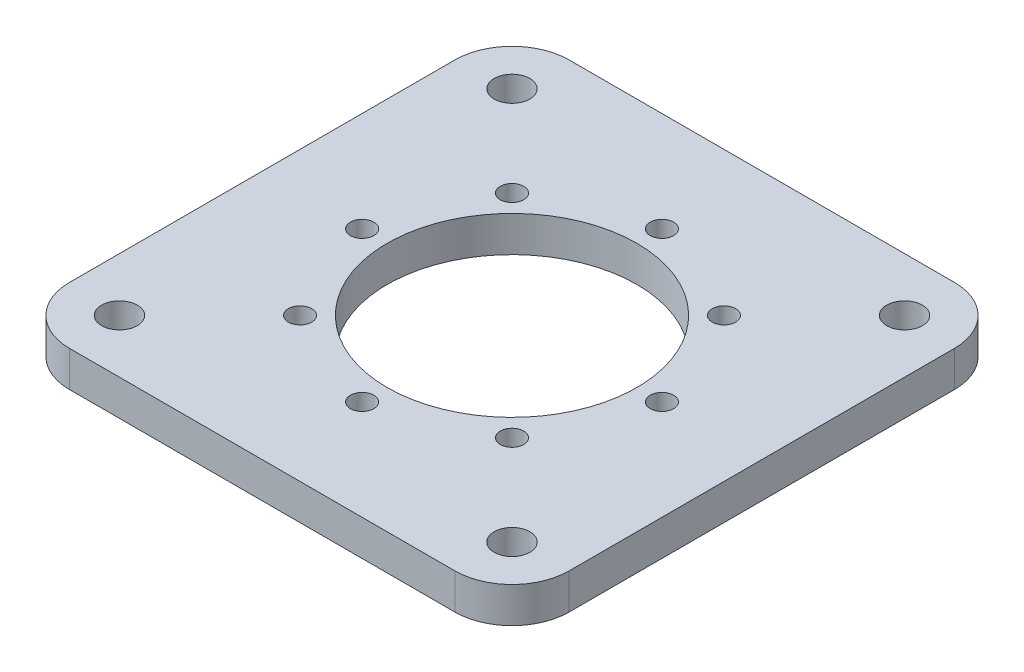
ISO-10303-21;
HEADER;
FILE_DESCRIPTION(('STEP AP214'),'2;1');
FILE_NAME('part.step','',(''),(''),'','','');
FILE_SCHEMA(('AUTOMOTIVE_DESIGN { 1 0 10303 214 1 1 1 1 }'));
ENDSEC;
DATA;
#1=APPLICATION_CONTEXT('core data for automotive mechanical design processes');
#2=APPLICATION_PROTOCOL_DEFINITION('international standard','automotive_design',2000,#1);
#3=PRODUCT_CONTEXT('',#1,'mechanical');
#4=PRODUCT('Part','Part','',(#3));
#5=PRODUCT_RELATED_PRODUCT_CATEGORY('part','',(#4));
#6=PRODUCT_DEFINITION_FORMATION('','',#4);
#7=PRODUCT_DEFINITION_CONTEXT('part definition',#1,'design');
#8=PRODUCT_DEFINITION('design','',#6,#7);
#9=PRODUCT_DEFINITION_SHAPE('','',#8);
#10=(LENGTH_UNIT() NAMED_UNIT(*) SI_UNIT(.MILLI.,.METRE.));
#11=(NAMED_UNIT(*) PLANE_ANGLE_UNIT() SI_UNIT($,.RADIAN.));
#12=(NAMED_UNIT(*) SI_UNIT($,.STERADIAN.) SOLID_ANGLE_UNIT());
#13=UNCERTAINTY_MEASURE_WITH_UNIT(LENGTH_MEASURE(1.E-05),#10,'distance_accuracy_value','');
#14=(GEOMETRIC_REPRESENTATION_CONTEXT(3) GLOBAL_UNCERTAINTY_ASSIGNED_CONTEXT((#13)) GLOBAL_UNIT_ASSIGNED_CONTEXT((#10,
#11,#12)) REPRESENTATION_CONTEXT('',''));
#15=CARTESIAN_POINT('',(0.,0.,0.));
#16=DIRECTION('',(0.,0.,1.));
#17=DIRECTION('',(1.,0.,0.));
#18=AXIS2_PLACEMENT_3D('',#15,#16,#17);
#19=CARTESIAN_POINT('',(34.29,6.35,-34.29));
#20=DIRECTION('',(0.,-1.,0.));
#21=DIRECTION('',(0.,0.,-1.));
#22=AXIS2_PLACEMENT_3D('',#19,#20,#21);
#23=PLANE('',#22);
#24=CARTESIAN_POINT('',(26.67,6.35,0.));
#25=DIRECTION('',(0.,1.,0.));
#26=DIRECTION('',(0.,0.,1.));
#27=AXIS2_PLACEMENT_3D('',#24,#25,#26);
#28=CIRCLE('',#27,2.0828);
#29=CARTESIAN_POINT('',(26.67,6.35,2.0828));
#30=VERTEX_POINT('',#29);
#31=EDGE_CURVE('E258',#30,#30,#28,.T.);
#32=ORIENTED_EDGE('',*,*,#31,.F.);
#33=EDGE_LOOP('',(#32));
#34=FACE_BOUND('',#33,.T.);
#35=CARTESIAN_POINT('',(18.8585378542452,6.35,18.8585378542452));
#36=DIRECTION('',(0.,1.,0.));
#37=DIRECTION('',(0.,0.,1.));
#38=AXIS2_PLACEMENT_3D('',#35,#36,#37);
#39=CIRCLE('',#38,2.0828);
#40=CARTESIAN_POINT('',(18.8585378542452,6.35,20.9413378542452));
#41=VERTEX_POINT('',#40);
#42=EDGE_CURVE('E255',#41,#41,#39,.T.);
#43=ORIENTED_EDGE('',*,*,#42,.F.);
#44=EDGE_LOOP('',(#43));
#45=FACE_BOUND('',#44,.T.);
#46=CARTESIAN_POINT('',(0.,6.35,26.67));
#47=DIRECTION('',(0.,1.,0.));
#48=DIRECTION('',(0.,0.,1.));
#49=AXIS2_PLACEMENT_3D('',#46,#47,#48);
#50=CIRCLE('',#49,2.0828);
#51=CARTESIAN_POINT('',(0.,6.35,28.7528));
#52=VERTEX_POINT('',#51);
#53=EDGE_CURVE('E249',#52,#52,#50,.T.);
#54=ORIENTED_EDGE('',*,*,#53,.F.);
#55=EDGE_LOOP('',(#54));
#56=FACE_BOUND('',#55,.T.);
#57=CARTESIAN_POINT('',(-18.8585378542452,6.35,18.8585378542452));
#58=DIRECTION('',(0.,1.,0.));
#59=DIRECTION('',(0.,0.,1.));
#60=AXIS2_PLACEMENT_3D('',#57,#58,#59);
#61=CIRCLE('',#60,2.0828);
#62=CARTESIAN_POINT('',(-18.8585378542452,6.35,20.9413378542452));
#63=VERTEX_POINT('',#62);
#64=EDGE_CURVE('E243',#63,#63,#61,.T.);
#65=ORIENTED_EDGE('',*,*,#64,.F.);
#66=EDGE_LOOP('',(#65));
#67=FACE_BOUND('',#66,.T.);
#68=CARTESIAN_POINT('',(-26.67,6.35,0.));
#69=DIRECTION('',(0.,1.,0.));
#70=DIRECTION('',(0.,0.,1.));
#71=AXIS2_PLACEMENT_3D('',#68,#69,#70);
#72=CIRCLE('',#71,2.08279999999999);
#73=CARTESIAN_POINT('',(-26.67,6.35,2.0828));
#74=VERTEX_POINT('',#73);
#75=EDGE_CURVE('E237',#74,#74,#72,.T.);
#76=ORIENTED_EDGE('',*,*,#75,.F.);
#77=EDGE_LOOP('',(#76));
#78=FACE_BOUND('',#77,.T.);
#79=CARTESIAN_POINT('',(-18.8585378542452,6.35,-18.8585378542452));
#80=DIRECTION('',(0.,1.,0.));
#81=DIRECTION('',(0.,0.,1.));
#82=AXIS2_PLACEMENT_3D('',#79,#80,#81);
#83=CIRCLE('',#82,2.0828);
#84=CARTESIAN_POINT('',(-18.8585378542452,6.35,-16.7757378542452));
#85=VERTEX_POINT('',#84);
#86=EDGE_CURVE('E231',#85,#85,#83,.T.);
#87=ORIENTED_EDGE('',*,*,#86,.F.);
#88=EDGE_LOOP('',(#87));
#89=FACE_BOUND('',#88,.T.);
#90=CARTESIAN_POINT('',(0.,6.35,-26.67));
#91=DIRECTION('',(0.,1.,0.));
#92=DIRECTION('',(0.,0.,1.));
#93=AXIS2_PLACEMENT_3D('',#90,#91,#92);
#94=CIRCLE('',#93,2.0828);
#95=CARTESIAN_POINT('',(0.,6.35,-24.5872));
#96=VERTEX_POINT('',#95);
#97=EDGE_CURVE('E225',#96,#96,#94,.T.);
#98=ORIENTED_EDGE('',*,*,#97,.F.);
#99=EDGE_LOOP('',(#98));
#100=FACE_BOUND('',#99,.T.);
#101=CARTESIAN_POINT('',(18.8585378542452,6.35,-18.8585378542452));
#102=DIRECTION('',(0.,1.,0.));
#103=DIRECTION('',(0.,0.,1.));
#104=AXIS2_PLACEMENT_3D('',#101,#102,#103);
#105=CIRCLE('',#104,2.0828);
#106=CARTESIAN_POINT('',(18.8585378542452,6.35,-16.7757378542452));
#107=VERTEX_POINT('',#106);
#108=EDGE_CURVE('E218',#107,#107,#105,.T.);
#109=ORIENTED_EDGE('',*,*,#108,.F.);
#110=EDGE_LOOP('',(#109));
#111=FACE_BOUND('',#110,.T.);
#112=CARTESIAN_POINT('',(34.29,6.35,-34.29));
#113=DIRECTION('',(0.,1.,0.));
#114=DIRECTION('',(0.,0.,-1.));
#115=AXIS2_PLACEMENT_3D('',#112,#113,#114);
#116=CIRCLE('',#115,10.16);
#117=CARTESIAN_POINT('',(44.45,6.35,-34.29));
#118=VERTEX_POINT('',#117);
#119=CARTESIAN_POINT('',(34.29,6.35,-44.45));
#120=VERTEX_POINT('',#119);
#121=EDGE_CURVE('E154',#118,#120,#116,.T.);
#122=ORIENTED_EDGE('',*,*,#121,.T.);
#123=DIRECTION('',(-1.,0.,0.));
#124=VECTOR('',#123,1.);
#125=CARTESIAN_POINT('',(-34.29,6.35,-44.45));
#126=LINE('',#125,#124);
#127=CARTESIAN_POINT('',(-34.29,6.35,-44.45));
#128=VERTEX_POINT('',#127);
#129=EDGE_CURVE('E102',#120,#128,#126,.T.);
#130=ORIENTED_EDGE('',*,*,#129,.T.);
#131=CARTESIAN_POINT('',(-34.29,6.35,-34.29));
#132=DIRECTION('',(0.,1.,0.));
#133=DIRECTION('',(0.,0.,-1.));
#134=AXIS2_PLACEMENT_3D('',#131,#132,#133);
#135=CIRCLE('',#134,10.16);
#136=CARTESIAN_POINT('',(-44.45,6.35,-34.29));
#137=VERTEX_POINT('',#136);
#138=EDGE_CURVE('E169',#128,#137,#135,.T.);
#139=ORIENTED_EDGE('',*,*,#138,.T.);
#140=DIRECTION('',(0.,0.,1.));
#141=VECTOR('',#140,1.);
#142=CARTESIAN_POINT('',(-44.45,6.35,34.29));
#143=LINE('',#142,#141);
#144=CARTESIAN_POINT('',(-44.45,6.35,34.29));
#145=VERTEX_POINT('',#144);
#146=EDGE_CURVE('E182',#137,#145,#143,.T.);
#147=ORIENTED_EDGE('',*,*,#146,.T.);
#148=CARTESIAN_POINT('',(-34.29,6.35,34.29));
#149=DIRECTION('',(0.,1.,0.));
#150=DIRECTION('',(0.,0.,-1.));
#151=AXIS2_PLACEMENT_3D('',#148,#149,#150);
#152=CIRCLE('',#151,10.16);
#153=CARTESIAN_POINT('',(-34.29,6.35,44.45));
#154=VERTEX_POINT('',#153);
#155=EDGE_CURVE('E121',#145,#154,#152,.T.);
#156=ORIENTED_EDGE('',*,*,#155,.T.);
#157=DIRECTION('',(1.,0.,0.));
#158=VECTOR('',#157,1.);
#159=CARTESIAN_POINT('',(-34.29,6.35,44.45));
#160=LINE('',#159,#158);
#161=CARTESIAN_POINT('',(34.29,6.35,44.45));
#162=VERTEX_POINT('',#161);
#163=EDGE_CURVE('E115',#154,#162,#160,.T.);
#164=ORIENTED_EDGE('',*,*,#163,.T.);
#165=CARTESIAN_POINT('',(34.29,6.35,34.29));
#166=DIRECTION('',(0.,1.,0.));
#167=DIRECTION('',(0.,0.,-1.));
#168=AXIS2_PLACEMENT_3D('',#165,#166,#167);
#169=CIRCLE('',#168,10.16);
#170=CARTESIAN_POINT('',(44.45,6.35,34.29));
#171=VERTEX_POINT('',#170);
#172=EDGE_CURVE('E119',#162,#171,#169,.T.);
#173=ORIENTED_EDGE('',*,*,#172,.T.);
#174=DIRECTION('',(0.,0.,-1.));
#175=VECTOR('',#174,1.);
#176=CARTESIAN_POINT('',(44.45,6.35,34.29));
#177=LINE('',#176,#175);
#178=EDGE_CURVE('E59',#171,#118,#177,.T.);
#179=ORIENTED_EDGE('',*,*,#178,.T.);
#180=EDGE_LOOP('',(#122,#130,#139,#147,#156,#164,#173,#179));
#181=FACE_BOUND('',#180,.T.);
#182=CARTESIAN_POINT('',(0.,6.35,0.));
#183=DIRECTION('',(0.,1.,0.));
#184=DIRECTION('',(0.,0.,1.));
#185=AXIS2_PLACEMENT_3D('',#182,#183,#184);
#186=CIRCLE('',#185,22.225);
#187=CARTESIAN_POINT('',(0.,6.35,22.225));
#188=VERTEX_POINT('',#187);
#189=EDGE_CURVE('E143',#188,#188,#186,.T.);
#190=ORIENTED_EDGE('',*,*,#189,.F.);
#191=EDGE_LOOP('',(#190));
#192=FACE_BOUND('',#191,.T.);
#193=CARTESIAN_POINT('',(-34.925,6.35,-34.925));
#194=DIRECTION('',(0.,1.,0.));
#195=DIRECTION('',(0.,0.,1.));
#196=AXIS2_PLACEMENT_3D('',#193,#194,#195);
#197=CIRCLE('',#196,3.175);
#198=CARTESIAN_POINT('',(-34.925,6.35,-31.75));
#199=VERTEX_POINT('',#198);
#200=EDGE_CURVE('E191',#199,#199,#197,.T.);
#201=ORIENTED_EDGE('',*,*,#200,.F.);
#202=EDGE_LOOP('',(#201));
#203=FACE_BOUND('',#202,.T.);
#204=CARTESIAN_POINT('',(34.925,6.35,-34.925));
#205=DIRECTION('',(0.,1.,0.));
#206=DIRECTION('',(0.,0.,-1.));
#207=AXIS2_PLACEMENT_3D('',#204,#205,#206);
#208=CIRCLE('',#207,3.175);
#209=CARTESIAN_POINT('',(34.925,6.35,-38.1));
#210=VERTEX_POINT('',#209);
#211=EDGE_CURVE('E197',#210,#210,#208,.T.);
#212=ORIENTED_EDGE('',*,*,#211,.F.);
#213=EDGE_LOOP('',(#212));
#214=FACE_BOUND('',#213,.T.);
#215=CARTESIAN_POINT('',(34.925,6.35,34.925));
#216=DIRECTION('',(0.,1.,0.));
#217=DIRECTION('',(0.,0.,1.));
#218=AXIS2_PLACEMENT_3D('',#215,#216,#217);
#219=CIRCLE('',#218,3.175);
#220=CARTESIAN_POINT('',(34.925,6.35,38.1));
#221=VERTEX_POINT('',#220);
#222=EDGE_CURVE('E203',#221,#221,#219,.T.);
#223=ORIENTED_EDGE('',*,*,#222,.F.);
#224=EDGE_LOOP('',(#223));
#225=FACE_BOUND('',#224,.T.);
#226=CARTESIAN_POINT('',(-34.925,6.35,34.925));
#227=DIRECTION('',(0.,1.,0.));
#228=DIRECTION('',(0.,0.,-1.));
#229=AXIS2_PLACEMENT_3D('',#226,#227,#228);
#230=CIRCLE('',#229,3.175);
#231=CARTESIAN_POINT('',(-34.925,6.35,31.75));
#232=VERTEX_POINT('',#231);
#233=EDGE_CURVE('E209',#232,#232,#230,.T.);
#234=ORIENTED_EDGE('',*,*,#233,.F.);
#235=EDGE_LOOP('',(#234));
#236=FACE_BOUND('',#235,.T.);
#237=ADVANCED_FACE('F42',(#34,#45,#56,#67,#78,#89,#100,#111,#181,#192,#203,#214,#225,#236),#23,.F.);
#238=CARTESIAN_POINT('',(34.29,0.,-34.29));
#239=DIRECTION('',(0.,-1.,0.));
#240=DIRECTION('',(0.,0.,-1.));
#241=AXIS2_PLACEMENT_3D('',#238,#239,#240);
#242=PLANE('',#241);
#243=CARTESIAN_POINT('',(26.67,0.,0.));
#244=DIRECTION('',(0.,-1.,0.));
#245=DIRECTION('',(0.,0.,-1.));
#246=AXIS2_PLACEMENT_3D('',#243,#244,#245);
#247=CIRCLE('',#246,2.0828);
#248=CARTESIAN_POINT('',(26.67,0.,-2.0828));
#249=VERTEX_POINT('',#248);
#250=EDGE_CURVE('E215',#249,#249,#247,.F.);
#251=ORIENTED_EDGE('',*,*,#250,.T.);
#252=EDGE_LOOP('',(#251));
#253=FACE_BOUND('',#252,.T.);
#254=CARTESIAN_POINT('',(18.8585378542452,0.,18.8585378542452));
#255=DIRECTION('',(0.,-1.,0.));
#256=DIRECTION('',(0.,0.,-1.));
#257=AXIS2_PLACEMENT_3D('',#254,#255,#256);
#258=CIRCLE('',#257,2.0828);
#259=CARTESIAN_POINT('',(18.8585378542452,0.,16.7757378542452));
#260=VERTEX_POINT('',#259);
#261=EDGE_CURVE('E252',#260,#260,#258,.F.);
#262=ORIENTED_EDGE('',*,*,#261,.T.);
#263=EDGE_LOOP('',(#262));
#264=FACE_BOUND('',#263,.T.);
#265=CARTESIAN_POINT('',(0.,0.,26.67));
#266=DIRECTION('',(0.,-1.,0.));
#267=DIRECTION('',(0.,0.,-1.));
#268=AXIS2_PLACEMENT_3D('',#265,#266,#267);
#269=CIRCLE('',#268,2.0828);
#270=CARTESIAN_POINT('',(0.,0.,24.5872));
#271=VERTEX_POINT('',#270);
#272=EDGE_CURVE('E246',#271,#271,#269,.F.);
#273=ORIENTED_EDGE('',*,*,#272,.T.);
#274=EDGE_LOOP('',(#273));
#275=FACE_BOUND('',#274,.T.);
#276=CARTESIAN_POINT('',(-18.8585378542452,0.,18.8585378542452));
#277=DIRECTION('',(0.,-1.,0.));
#278=DIRECTION('',(0.,0.,-1.));
#279=AXIS2_PLACEMENT_3D('',#276,#277,#278);
#280=CIRCLE('',#279,2.0828);
#281=CARTESIAN_POINT('',(-18.8585378542452,0.,16.7757378542452));
#282=VERTEX_POINT('',#281);
#283=EDGE_CURVE('E240',#282,#282,#280,.F.);
#284=ORIENTED_EDGE('',*,*,#283,.T.);
#285=EDGE_LOOP('',(#284));
#286=FACE_BOUND('',#285,.T.);
#287=CARTESIAN_POINT('',(-26.67,0.,0.));
#288=DIRECTION('',(0.,-1.,0.));
#289=DIRECTION('',(0.,0.,-1.));
#290=AXIS2_PLACEMENT_3D('',#287,#288,#289);
#291=CIRCLE('',#290,2.08279999999999);
#292=CARTESIAN_POINT('',(-26.67,0.,-2.08279999999999));
#293=VERTEX_POINT('',#292);
#294=EDGE_CURVE('E234',#293,#293,#291,.F.);
#295=ORIENTED_EDGE('',*,*,#294,.T.);
#296=EDGE_LOOP('',(#295));
#297=FACE_BOUND('',#296,.T.);
#298=CARTESIAN_POINT('',(-18.8585378542452,0.,-18.8585378542452));
#299=DIRECTION('',(0.,-1.,0.));
#300=DIRECTION('',(0.,0.,-1.));
#301=AXIS2_PLACEMENT_3D('',#298,#299,#300);
#302=CIRCLE('',#301,2.0828);
#303=CARTESIAN_POINT('',(-18.8585378542452,0.,-20.9413378542452));
#304=VERTEX_POINT('',#303);
#305=EDGE_CURVE('E228',#304,#304,#302,.F.);
#306=ORIENTED_EDGE('',*,*,#305,.T.);
#307=EDGE_LOOP('',(#306));
#308=FACE_BOUND('',#307,.T.);
#309=CARTESIAN_POINT('',(0.,0.,-26.67));
#310=DIRECTION('',(0.,-1.,0.));
#311=DIRECTION('',(0.,0.,-1.));
#312=AXIS2_PLACEMENT_3D('',#309,#310,#311);
#313=CIRCLE('',#312,2.0828);
#314=CARTESIAN_POINT('',(0.,0.,-28.7528));
#315=VERTEX_POINT('',#314);
#316=EDGE_CURVE('E221',#315,#315,#313,.F.);
#317=ORIENTED_EDGE('',*,*,#316,.T.);
#318=EDGE_LOOP('',(#317));
#319=FACE_BOUND('',#318,.T.);
#320=CARTESIAN_POINT('',(18.8585378542452,0.,-18.8585378542452));
#321=DIRECTION('',(0.,-1.,0.));
#322=DIRECTION('',(0.,0.,-1.));
#323=AXIS2_PLACEMENT_3D('',#320,#321,#322);
#324=CIRCLE('',#323,2.0828);
#325=CARTESIAN_POINT('',(18.8585378542452,0.,-20.9413378542452));
#326=VERTEX_POINT('',#325);
#327=EDGE_CURVE('E222',#326,#326,#324,.F.);
#328=ORIENTED_EDGE('',*,*,#327,.T.);
#329=EDGE_LOOP('',(#328));
#330=FACE_BOUND('',#329,.T.);
#331=CARTESIAN_POINT('',(34.925,0.,34.925));
#332=DIRECTION('',(0.,1.,0.));
#333=DIRECTION('',(0.,0.,1.));
#334=AXIS2_PLACEMENT_3D('',#331,#332,#333);
#335=CIRCLE('',#334,3.175);
#336=CARTESIAN_POINT('',(34.925,0.,38.1));
#337=VERTEX_POINT('',#336);
#338=EDGE_CURVE('E206',#337,#337,#335,.T.);
#339=ORIENTED_EDGE('',*,*,#338,.T.);
#340=EDGE_LOOP('',(#339));
#341=FACE_BOUND('',#340,.T.);
#342=CARTESIAN_POINT('',(-34.925,0.,-34.925));
#343=DIRECTION('',(0.,1.,0.));
#344=DIRECTION('',(0.,0.,1.));
#345=AXIS2_PLACEMENT_3D('',#342,#343,#344);
#346=CIRCLE('',#345,3.175);
#347=CARTESIAN_POINT('',(-34.925,0.,-31.75));
#348=VERTEX_POINT('',#347);
#349=EDGE_CURVE('E194',#348,#348,#346,.T.);
#350=ORIENTED_EDGE('',*,*,#349,.T.);
#351=EDGE_LOOP('',(#350));
#352=FACE_BOUND('',#351,.T.);
#353=CARTESIAN_POINT('',(34.29,0.,-34.29));
#354=DIRECTION('',(0.,1.,0.));
#355=DIRECTION('',(0.,0.,-1.));
#356=AXIS2_PLACEMENT_3D('',#353,#354,#355);
#357=CIRCLE('',#356,10.16);
#358=CARTESIAN_POINT('',(44.45,0.,-34.29));
#359=VERTEX_POINT('',#358);
#360=CARTESIAN_POINT('',(34.29,0.,-44.45));
#361=VERTEX_POINT('',#360);
#362=EDGE_CURVE('E139',#359,#361,#357,.T.);
#363=ORIENTED_EDGE('',*,*,#362,.F.);
#364=DIRECTION('',(0.,0.,-1.));
#365=VECTOR('',#364,1.);
#366=CARTESIAN_POINT('',(44.45,0.,34.29));
#367=LINE('',#366,#365);
#368=CARTESIAN_POINT('',(44.45,0.,34.29));
#369=VERTEX_POINT('',#368);
#370=EDGE_CURVE('E94',#369,#359,#367,.T.);
#371=ORIENTED_EDGE('',*,*,#370,.F.);
#372=CARTESIAN_POINT('',(34.29,0.,34.29));
#373=DIRECTION('',(0.,1.,0.));
#374=DIRECTION('',(0.,0.,-1.));
#375=AXIS2_PLACEMENT_3D('',#372,#373,#374);
#376=CIRCLE('',#375,10.16);
#377=CARTESIAN_POINT('',(34.29,0.,44.45));
#378=VERTEX_POINT('',#377);
#379=EDGE_CURVE('E88',#378,#369,#376,.T.);
#380=ORIENTED_EDGE('',*,*,#379,.F.);
#381=DIRECTION('',(1.,0.,0.));
#382=VECTOR('',#381,1.);
#383=CARTESIAN_POINT('',(-34.29,0.,44.45));
#384=LINE('',#383,#382);
#385=CARTESIAN_POINT('',(-34.29,0.,44.45));
#386=VERTEX_POINT('',#385);
#387=EDGE_CURVE('E129',#386,#378,#384,.T.);
#388=ORIENTED_EDGE('',*,*,#387,.F.);
#389=CARTESIAN_POINT('',(-34.29,0.,34.29));
#390=DIRECTION('',(0.,1.,0.));
#391=DIRECTION('',(0.,0.,-1.));
#392=AXIS2_PLACEMENT_3D('',#389,#390,#391);
#393=CIRCLE('',#392,10.16);
#394=CARTESIAN_POINT('',(-44.45,0.,34.29));
#395=VERTEX_POINT('',#394);
#396=EDGE_CURVE('E149',#395,#386,#393,.T.);
#397=ORIENTED_EDGE('',*,*,#396,.F.);
#398=DIRECTION('',(0.,0.,1.));
#399=VECTOR('',#398,1.);
#400=CARTESIAN_POINT('',(-44.45,0.,34.29));
#401=LINE('',#400,#399);
#402=CARTESIAN_POINT('',(-44.45,0.,-34.29));
#403=VERTEX_POINT('',#402);
#404=EDGE_CURVE('E147',#403,#395,#401,.T.);
#405=ORIENTED_EDGE('',*,*,#404,.F.);
#406=CARTESIAN_POINT('',(-34.29,0.,-34.29));
#407=DIRECTION('',(0.,1.,0.));
#408=DIRECTION('',(0.,0.,-1.));
#409=AXIS2_PLACEMENT_3D('',#406,#407,#408);
#410=CIRCLE('',#409,10.16);
#411=CARTESIAN_POINT('',(-34.29,0.,-44.45));
#412=VERTEX_POINT('',#411);
#413=EDGE_CURVE('E145',#412,#403,#410,.T.);
#414=ORIENTED_EDGE('',*,*,#413,.F.);
#415=DIRECTION('',(-1.,0.,0.));
#416=VECTOR('',#415,1.);
#417=CARTESIAN_POINT('',(-34.29,0.,-44.45));
#418=LINE('',#417,#416);
#419=EDGE_CURVE('E142',#361,#412,#418,.T.);
#420=ORIENTED_EDGE('',*,*,#419,.F.);
#421=EDGE_LOOP('',(#363,#371,#380,#388,#397,#405,#414,#420));
#422=FACE_BOUND('',#421,.T.);
#423=CARTESIAN_POINT('',(0.,0.,0.));
#424=DIRECTION('',(0.,1.,0.));
#425=DIRECTION('',(0.,0.,1.));
#426=AXIS2_PLACEMENT_3D('',#423,#424,#425);
#427=CIRCLE('',#426,22.225);
#428=CARTESIAN_POINT('',(0.,0.,22.225));
#429=VERTEX_POINT('',#428);
#430=EDGE_CURVE('E188',#429,#429,#427,.T.);
#431=ORIENTED_EDGE('',*,*,#430,.T.);
#432=EDGE_LOOP('',(#431));
#433=FACE_BOUND('',#432,.T.);
#434=CARTESIAN_POINT('',(34.925,0.,-34.925));
#435=DIRECTION('',(0.,1.,0.));
#436=DIRECTION('',(0.,0.,-1.));
#437=AXIS2_PLACEMENT_3D('',#434,#435,#436);
#438=CIRCLE('',#437,3.175);
#439=CARTESIAN_POINT('',(34.925,0.,-38.1));
#440=VERTEX_POINT('',#439);
#441=EDGE_CURVE('E200',#440,#440,#438,.T.);
#442=ORIENTED_EDGE('',*,*,#441,.T.);
#443=EDGE_LOOP('',(#442));
#444=FACE_BOUND('',#443,.T.);
#445=CARTESIAN_POINT('',(-34.925,0.,34.925));
#446=DIRECTION('',(0.,1.,0.));
#447=DIRECTION('',(0.,0.,-1.));
#448=AXIS2_PLACEMENT_3D('',#445,#446,#447);
#449=CIRCLE('',#448,3.175);
#450=CARTESIAN_POINT('',(-34.925,0.,31.75));
#451=VERTEX_POINT('',#450);
#452=EDGE_CURVE('E212',#451,#451,#449,.T.);
#453=ORIENTED_EDGE('',*,*,#452,.T.);
#454=EDGE_LOOP('',(#453));
#455=FACE_BOUND('',#454,.T.);
#456=ADVANCED_FACE('F173',(#253,#264,#275,#286,#297,#308,#319,#330,#341,#352,#422,#433,#444,
#455),#242,.T.);
#457=CARTESIAN_POINT('',(34.29,6.35,-34.29));
#458=DIRECTION('',(0.,-1.,0.));
#459=DIRECTION('',(0.,0.,-1.));
#460=AXIS2_PLACEMENT_3D('',#457,#458,#459);
#461=CYLINDRICAL_SURFACE('',#460,10.16);
#462=ORIENTED_EDGE('',*,*,#362,.T.);
#463=DIRECTION('',(0.,-1.,0.));
#464=VECTOR('',#463,1.);
#465=CARTESIAN_POINT('',(34.29,6.35,-44.45));
#466=LINE('',#465,#464);
#467=EDGE_CURVE('E11',#120,#361,#466,.T.);
#468=ORIENTED_EDGE('',*,*,#467,.F.);
#469=ORIENTED_EDGE('',*,*,#121,.F.);
#470=DIRECTION('',(0.,-1.,0.));
#471=VECTOR('',#470,1.);
#472=CARTESIAN_POINT('',(44.45,6.35,-34.29));
#473=LINE('',#472,#471);
#474=EDGE_CURVE('E135',#118,#359,#473,.T.);
#475=ORIENTED_EDGE('',*,*,#474,.T.);
#476=EDGE_LOOP('',(#462,#468,#469,#475));
#477=FACE_BOUND('',#476,.T.);
#478=ADVANCED_FACE('F44',(#477),#461,.T.);
#479=CARTESIAN_POINT('',(-34.29,6.35,-44.45));
#480=DIRECTION('',(0.,0.,1.));
#481=DIRECTION('',(1.,0.,0.));
#482=AXIS2_PLACEMENT_3D('',#479,#480,#481);
#483=PLANE('',#482);
#484=ORIENTED_EDGE('',*,*,#419,.T.);
#485=DIRECTION('',(0.,-1.,0.));
#486=VECTOR('',#485,1.);
#487=CARTESIAN_POINT('',(-34.29,6.35,-44.45));
#488=LINE('',#487,#486);
#489=EDGE_CURVE('E51',#128,#412,#488,.T.);
#490=ORIENTED_EDGE('',*,*,#489,.F.);
#491=ORIENTED_EDGE('',*,*,#129,.F.);
#492=ORIENTED_EDGE('',*,*,#467,.T.);
#493=EDGE_LOOP('',(#484,#490,#491,#492));
#494=FACE_BOUND('',#493,.T.);
#495=ADVANCED_FACE('F331',(#494),#483,.F.);
#496=CARTESIAN_POINT('',(-34.29,6.35,-34.29));
#497=DIRECTION('',(0.,-1.,0.));
#498=DIRECTION('',(0.,0.,-1.));
#499=AXIS2_PLACEMENT_3D('',#496,#497,#498);
#500=CYLINDRICAL_SURFACE('',#499,10.16);
#501=ORIENTED_EDGE('',*,*,#413,.T.);
#502=DIRECTION('',(0.,-1.,0.));
#503=VECTOR('',#502,1.);
#504=CARTESIAN_POINT('',(-44.45,6.35,-34.29));
#505=LINE('',#504,#503);
#506=EDGE_CURVE('E161',#137,#403,#505,.T.);
#507=ORIENTED_EDGE('',*,*,#506,.F.);
#508=ORIENTED_EDGE('',*,*,#138,.F.);
#509=ORIENTED_EDGE('',*,*,#489,.T.);
#510=EDGE_LOOP('',(#501,#507,#508,#509));
#511=FACE_BOUND('',#510,.T.);
#512=ADVANCED_FACE('F167',(#511),#500,.T.);
#513=CARTESIAN_POINT('',(-44.45,6.35,34.29));
#514=DIRECTION('',(1.,0.,0.));
#515=DIRECTION('',(0.,0.,-1.));
#516=AXIS2_PLACEMENT_3D('',#513,#514,#515);
#517=PLANE('',#516);
#518=ORIENTED_EDGE('',*,*,#404,.T.);
#519=DIRECTION('',(0.,-1.,0.));
#520=VECTOR('',#519,1.);
#521=CARTESIAN_POINT('',(-44.45,6.35,34.29));
#522=LINE('',#521,#520);
#523=EDGE_CURVE('E158',#145,#395,#522,.T.);
#524=ORIENTED_EDGE('',*,*,#523,.F.);
#525=ORIENTED_EDGE('',*,*,#146,.F.);
#526=ORIENTED_EDGE('',*,*,#506,.T.);
#527=EDGE_LOOP('',(#518,#524,#525,#526));
#528=FACE_BOUND('',#527,.T.);
#529=ADVANCED_FACE('F178',(#528),#517,.F.);
#530=CARTESIAN_POINT('',(-34.29,6.35,34.29));
#531=DIRECTION('',(0.,-1.,0.));
#532=DIRECTION('',(0.,0.,-1.));
#533=AXIS2_PLACEMENT_3D('',#530,#531,#532);
#534=CYLINDRICAL_SURFACE('',#533,10.16);
#535=ORIENTED_EDGE('',*,*,#396,.T.);
#536=DIRECTION('',(0.,-1.,0.));
#537=VECTOR('',#536,1.);
#538=CARTESIAN_POINT('',(-34.29,6.35,44.45));
#539=LINE('',#538,#537);
#540=EDGE_CURVE('E130',#154,#386,#539,.T.);
#541=ORIENTED_EDGE('',*,*,#540,.F.);
#542=ORIENTED_EDGE('',*,*,#155,.F.);
#543=ORIENTED_EDGE('',*,*,#523,.T.);
#544=EDGE_LOOP('',(#535,#541,#542,#543));
#545=FACE_BOUND('',#544,.T.);
#546=ADVANCED_FACE('F181',(#545),#534,.T.);
#547=CARTESIAN_POINT('',(-34.29,6.35,44.45));
#548=DIRECTION('',(0.,0.,-1.));
#549=DIRECTION('',(-1.,0.,0.));
#550=AXIS2_PLACEMENT_3D('',#547,#548,#549);
#551=PLANE('',#550);
#552=ORIENTED_EDGE('',*,*,#387,.T.);
#553=DIRECTION('',(0.,-1.,0.));
#554=VECTOR('',#553,1.);
#555=CARTESIAN_POINT('',(34.29,6.35,44.45));
#556=LINE('',#555,#554);
#557=EDGE_CURVE('E126',#162,#378,#556,.T.);
#558=ORIENTED_EDGE('',*,*,#557,.F.);
#559=ORIENTED_EDGE('',*,*,#163,.F.);
#560=ORIENTED_EDGE('',*,*,#540,.T.);
#561=EDGE_LOOP('',(#552,#558,#559,#560));
#562=FACE_BOUND('',#561,.T.);
#563=ADVANCED_FACE('F127',(#562),#551,.F.);
#564=CARTESIAN_POINT('',(34.29,6.35,34.29));
#565=DIRECTION('',(0.,-1.,0.));
#566=DIRECTION('',(0.,0.,-1.));
#567=AXIS2_PLACEMENT_3D('',#564,#565,#566);
#568=CYLINDRICAL_SURFACE('',#567,10.16);
#569=ORIENTED_EDGE('',*,*,#379,.T.);
#570=DIRECTION('',(0.,-1.,0.));
#571=VECTOR('',#570,1.);
#572=CARTESIAN_POINT('',(44.45,6.35,34.29));
#573=LINE('',#572,#571);
#574=EDGE_CURVE('E131',#171,#369,#573,.T.);
#575=ORIENTED_EDGE('',*,*,#574,.F.);
#576=ORIENTED_EDGE('',*,*,#172,.F.);
#577=ORIENTED_EDGE('',*,*,#557,.T.);
#578=EDGE_LOOP('',(#569,#575,#576,#577));
#579=FACE_BOUND('',#578,.T.);
#580=ADVANCED_FACE('F133',(#579),#568,.T.);
#581=CARTESIAN_POINT('',(44.45,6.35,34.29));
#582=DIRECTION('',(-1.,0.,0.));
#583=DIRECTION('',(0.,0.,1.));
#584=AXIS2_PLACEMENT_3D('',#581,#582,#583);
#585=PLANE('',#584);
#586=ORIENTED_EDGE('',*,*,#370,.T.);
#587=ORIENTED_EDGE('',*,*,#474,.F.);
#588=ORIENTED_EDGE('',*,*,#178,.F.);
#589=ORIENTED_EDGE('',*,*,#574,.T.);
#590=EDGE_LOOP('',(#586,#587,#588,#589));
#591=FACE_BOUND('',#590,.T.);
#592=ADVANCED_FACE('F315',(#591),#585,.F.);
#593=CARTESIAN_POINT('',(0.,6.35,0.));
#594=DIRECTION('',(0.,-1.,0.));
#595=DIRECTION('',(0.,0.,-1.));
#596=AXIS2_PLACEMENT_3D('',#593,#594,#595);
#597=CYLINDRICAL_SURFACE('',#596,22.225);
#598=ORIENTED_EDGE('',*,*,#189,.T.);
#599=EDGE_LOOP('',(#598));
#600=FACE_BOUND('',#599,.T.);
#601=ORIENTED_EDGE('',*,*,#430,.F.);
#602=EDGE_LOOP('',(#601));
#603=FACE_BOUND('',#602,.T.);
#604=ADVANCED_FACE('F305',(#600,#603),#597,.F.);
#605=CARTESIAN_POINT('',(-34.925,6.35,-34.925));
#606=DIRECTION('',(0.,-1.,0.));
#607=DIRECTION('',(0.,0.,-1.));
#608=AXIS2_PLACEMENT_3D('',#605,#606,#607);
#609=CYLINDRICAL_SURFACE('',#608,3.175);
#610=ORIENTED_EDGE('',*,*,#200,.T.);
#611=EDGE_LOOP('',(#610));
#612=FACE_BOUND('',#611,.T.);
#613=ORIENTED_EDGE('',*,*,#349,.F.);
#614=EDGE_LOOP('',(#613));
#615=FACE_BOUND('',#614,.T.);
#616=ADVANCED_FACE('F302',(#612,#615),#609,.F.);
#617=CARTESIAN_POINT('',(34.925,6.35,-34.925));
#618=DIRECTION('',(0.,-1.,0.));
#619=DIRECTION('',(0.,0.,-1.));
#620=AXIS2_PLACEMENT_3D('',#617,#618,#619);
#621=CYLINDRICAL_SURFACE('',#620,3.175);
#622=ORIENTED_EDGE('',*,*,#211,.T.);
#623=EDGE_LOOP('',(#622));
#624=FACE_BOUND('',#623,.T.);
#625=ORIENTED_EDGE('',*,*,#441,.F.);
#626=EDGE_LOOP('',(#625));
#627=FACE_BOUND('',#626,.T.);
#628=ADVANCED_FACE('F304',(#624,#627),#621,.F.);
#629=CARTESIAN_POINT('',(34.925,6.35,34.925));
#630=DIRECTION('',(0.,-1.,0.));
#631=DIRECTION('',(0.,0.,-1.));
#632=AXIS2_PLACEMENT_3D('',#629,#630,#631);
#633=CYLINDRICAL_SURFACE('',#632,3.175);
#634=ORIENTED_EDGE('',*,*,#222,.T.);
#635=EDGE_LOOP('',(#634));
#636=FACE_BOUND('',#635,.T.);
#637=ORIENTED_EDGE('',*,*,#338,.F.);
#638=EDGE_LOOP('',(#637));
#639=FACE_BOUND('',#638,.T.);
#640=ADVANCED_FACE('F312',(#636,#639),#633,.F.);
#641=CARTESIAN_POINT('',(-34.925,6.35,34.925));
#642=DIRECTION('',(0.,-1.,0.));
#643=DIRECTION('',(0.,0.,-1.));
#644=AXIS2_PLACEMENT_3D('',#641,#642,#643);
#645=CYLINDRICAL_SURFACE('',#644,3.175);
#646=ORIENTED_EDGE('',*,*,#233,.T.);
#647=EDGE_LOOP('',(#646));
#648=FACE_BOUND('',#647,.T.);
#649=ORIENTED_EDGE('',*,*,#452,.F.);
#650=EDGE_LOOP('',(#649));
#651=FACE_BOUND('',#650,.T.);
#652=ADVANCED_FACE('F290',(#648,#651),#645,.F.);
#653=CARTESIAN_POINT('',(18.8585378542452,-5.89104801542137,-18.8585378542452));
#654=DIRECTION('',(0.,1.,0.));
#655=DIRECTION('',(0.,0.,1.));
#656=AXIS2_PLACEMENT_3D('',#653,#654,#655);
#657=CYLINDRICAL_SURFACE('',#656,2.0828);
#658=ORIENTED_EDGE('',*,*,#108,.T.);
#659=EDGE_LOOP('',(#658));
#660=FACE_BOUND('',#659,.T.);
#661=ORIENTED_EDGE('',*,*,#327,.F.);
#662=EDGE_LOOP('',(#661));
#663=FACE_BOUND('',#662,.T.);
#664=ADVANCED_FACE('F286',(#660,#663),#657,.F.);
#665=CARTESIAN_POINT('',(0.,-5.89104801542137,-26.67));
#666=DIRECTION('',(0.,1.,0.));
#667=DIRECTION('',(0.,0.,1.));
#668=AXIS2_PLACEMENT_3D('',#665,#666,#667);
#669=CYLINDRICAL_SURFACE('',#668,2.0828);
#670=ORIENTED_EDGE('',*,*,#97,.T.);
#671=EDGE_LOOP('',(#670));
#672=FACE_BOUND('',#671,.T.);
#673=ORIENTED_EDGE('',*,*,#316,.F.);
#674=EDGE_LOOP('',(#673));
#675=FACE_BOUND('',#674,.T.);
#676=ADVANCED_FACE('F289',(#672,#675),#669,.F.);
#677=CARTESIAN_POINT('',(-18.8585378542452,-5.89104801542137,-18.8585378542452));
#678=DIRECTION('',(0.,1.,0.));
#679=DIRECTION('',(0.,0.,1.));
#680=AXIS2_PLACEMENT_3D('',#677,#678,#679);
#681=CYLINDRICAL_SURFACE('',#680,2.0828);
#682=ORIENTED_EDGE('',*,*,#86,.T.);
#683=EDGE_LOOP('',(#682));
#684=FACE_BOUND('',#683,.T.);
#685=ORIENTED_EDGE('',*,*,#305,.F.);
#686=EDGE_LOOP('',(#685));
#687=FACE_BOUND('',#686,.T.);
#688=ADVANCED_FACE('F471',(#684,#687),#681,.F.);
#689=CARTESIAN_POINT('',(-26.67,-5.89104801542137,0.));
#690=DIRECTION('',(0.,1.,0.));
#691=DIRECTION('',(0.,0.,1.));
#692=AXIS2_PLACEMENT_3D('',#689,#690,#691);
#693=CYLINDRICAL_SURFACE('',#692,2.08279999999999);
#694=ORIENTED_EDGE('',*,*,#75,.T.);
#695=EDGE_LOOP('',(#694));
#696=FACE_BOUND('',#695,.T.);
#697=ORIENTED_EDGE('',*,*,#294,.F.);
#698=EDGE_LOOP('',(#697));
#699=FACE_BOUND('',#698,.T.);
#700=ADVANCED_FACE('F481',(#696,#699),#693,.F.);
#701=CARTESIAN_POINT('',(-18.8585378542452,-5.89104801542137,18.8585378542452));
#702=DIRECTION('',(0.,1.,0.));
#703=DIRECTION('',(0.,0.,1.));
#704=AXIS2_PLACEMENT_3D('',#701,#702,#703);
#705=CYLINDRICAL_SURFACE('',#704,2.0828);
#706=ORIENTED_EDGE('',*,*,#64,.T.);
#707=EDGE_LOOP('',(#706));
#708=FACE_BOUND('',#707,.T.);
#709=ORIENTED_EDGE('',*,*,#283,.F.);
#710=EDGE_LOOP('',(#709));
#711=FACE_BOUND('',#710,.T.);
#712=ADVANCED_FACE('F491',(#708,#711),#705,.F.);
#713=CARTESIAN_POINT('',(0.,-5.89104801542137,26.67));
#714=DIRECTION('',(0.,1.,0.));
#715=DIRECTION('',(0.,0.,1.));
#716=AXIS2_PLACEMENT_3D('',#713,#714,#715);
#717=CYLINDRICAL_SURFACE('',#716,2.0828);
#718=ORIENTED_EDGE('',*,*,#53,.T.);
#719=EDGE_LOOP('',(#718));
#720=FACE_BOUND('',#719,.T.);
#721=ORIENTED_EDGE('',*,*,#272,.F.);
#722=EDGE_LOOP('',(#721));
#723=FACE_BOUND('',#722,.T.);
#724=ADVANCED_FACE('F501',(#720,#723),#717,.F.);
#725=CARTESIAN_POINT('',(18.8585378542452,-5.89104801542137,18.8585378542452));
#726=DIRECTION('',(0.,1.,0.));
#727=DIRECTION('',(0.,0.,1.));
#728=AXIS2_PLACEMENT_3D('',#725,#726,#727);
#729=CYLINDRICAL_SURFACE('',#728,2.0828);
#730=ORIENTED_EDGE('',*,*,#42,.T.);
#731=EDGE_LOOP('',(#730));
#732=FACE_BOUND('',#731,.T.);
#733=ORIENTED_EDGE('',*,*,#261,.F.);
#734=EDGE_LOOP('',(#733));
#735=FACE_BOUND('',#734,.T.);
#736=ADVANCED_FACE('F511',(#732,#735),#729,.F.);
#737=CARTESIAN_POINT('',(26.67,-5.89104801542137,0.));
#738=DIRECTION('',(0.,1.,0.));
#739=DIRECTION('',(0.,0.,1.));
#740=AXIS2_PLACEMENT_3D('',#737,#738,#739);
#741=CYLINDRICAL_SURFACE('',#740,2.0828);
#742=ORIENTED_EDGE('',*,*,#31,.T.);
#743=EDGE_LOOP('',(#742));
#744=FACE_BOUND('',#743,.T.);
#745=ORIENTED_EDGE('',*,*,#250,.F.);
#746=EDGE_LOOP('',(#745));
#747=FACE_BOUND('',#746,.T.);
#748=ADVANCED_FACE('F266',(#744,#747),#741,.F.);
#749=CLOSED_SHELL('',(#237,#456,#478,#495,#512,#529,#546,#563,#580,#592,#604,#616,#628,#640,
#652,#664,#676,#688,#700,#712,#724,#736,#748));
#750=MANIFOLD_SOLID_BREP('B2',#749);
#751=ADVANCED_BREP_SHAPE_REPRESENTATION('',(#18,#750),#14);
#752=SHAPE_DEFINITION_REPRESENTATION(#9,#751);
ENDSEC;
END-ISO-10303-21;
